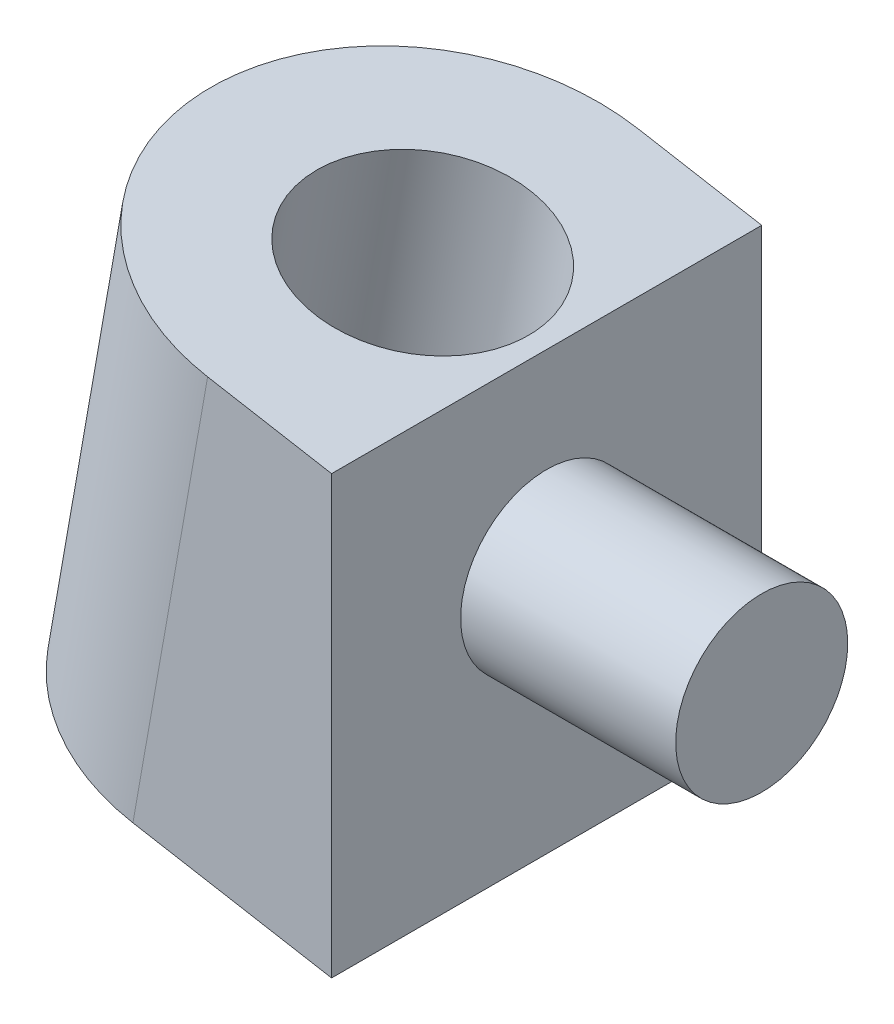
ISO-10303-21;
HEADER;
FILE_DESCRIPTION(('STEP AP214'),'2;1');
FILE_NAME('part.step','',(''),(''),'','','');
FILE_SCHEMA(('AUTOMOTIVE_DESIGN { 1 0 10303 214 1 1 1 1 }'));
ENDSEC;
DATA;
#1=APPLICATION_CONTEXT('core data for automotive mechanical design processes');
#2=APPLICATION_PROTOCOL_DEFINITION('international standard','automotive_design',2000,#1);
#3=PRODUCT_CONTEXT('',#1,'mechanical');
#4=PRODUCT('Part','Part','',(#3));
#5=PRODUCT_RELATED_PRODUCT_CATEGORY('part','',(#4));
#6=PRODUCT_DEFINITION_FORMATION('','',#4);
#7=PRODUCT_DEFINITION_CONTEXT('part definition',#1,'design');
#8=PRODUCT_DEFINITION('design','',#6,#7);
#9=PRODUCT_DEFINITION_SHAPE('','',#8);
#10=(LENGTH_UNIT() NAMED_UNIT(*) SI_UNIT(.MILLI.,.METRE.));
#11=(NAMED_UNIT(*) PLANE_ANGLE_UNIT() SI_UNIT($,.RADIAN.));
#12=(NAMED_UNIT(*) SI_UNIT($,.STERADIAN.) SOLID_ANGLE_UNIT());
#13=UNCERTAINTY_MEASURE_WITH_UNIT(LENGTH_MEASURE(1.E-05),#10,'distance_accuracy_value','');
#14=(GEOMETRIC_REPRESENTATION_CONTEXT(3) GLOBAL_UNCERTAINTY_ASSIGNED_CONTEXT((#13)) GLOBAL_UNIT_ASSIGNED_CONTEXT((#10,
#11,#12)) REPRESENTATION_CONTEXT('',''));
#15=CARTESIAN_POINT('',(0.,0.,0.));
#16=DIRECTION('',(0.,0.,1.));
#17=DIRECTION('',(1.,0.,0.));
#18=AXIS2_PLACEMENT_3D('',#15,#16,#17);
#19=CARTESIAN_POINT('',(-1.73648177666927,-9.84807753012208,0.));
#20=DIRECTION('',(-0.173648177666927,-0.984807753012209,0.));
#21=DIRECTION('',(0.984807753012209,-0.173648177666927,0.));
#22=AXIS2_PLACEMENT_3D('',#19,#20,#21);
#23=PLANE('',#22);
#24=CARTESIAN_POINT('',(-1.73648177666927,-9.84807753012208,0.));
#25=DIRECTION('',(-0.173648177666927,-0.984807753012209,0.));
#26=DIRECTION('',(0.984807753012209,-0.173648177666927,0.));
#27=AXIS2_PLACEMENT_3D('',#24,#25,#26);
#28=CIRCLE('',#27,5.);
#29=CARTESIAN_POINT('',(-6.66052054173032,-8.97983664178745,0.));
#30=VERTEX_POINT('',#29);
#31=EDGE_CURVE('E186',#30,#30,#28,.T.);
#32=ORIENTED_EDGE('',*,*,#31,.F.);
#33=EDGE_LOOP('',(#32));
#34=FACE_BOUND('',#33,.T.);
#35=DIRECTION('',(0.984807753012209,-0.173648177666927,0.));
#36=VECTOR('',#35,1.);
#37=CARTESIAN_POINT('',(-1.73648177666927,-9.84807753012209,10.));
#38=LINE('',#37,#36);
#39=CARTESIAN_POINT('',(-1.73648177666927,-9.84807753012209,10.));
#40=VERTEX_POINT('',#39);
#41=CARTESIAN_POINT('',(7.5,-11.4767184741709,10.));
#42=VERTEX_POINT('',#41);
#43=EDGE_CURVE('E114',#40,#42,#38,.T.);
#44=ORIENTED_EDGE('',*,*,#43,.F.);
#45=CARTESIAN_POINT('',(-1.73648177666927,-9.84807753012208,0.));
#46=DIRECTION('',(-0.173648177666927,-0.984807753012209,0.));
#47=DIRECTION('',(0.984807753012209,-0.173648177666927,0.));
#48=AXIS2_PLACEMENT_3D('',#45,#46,#47);
#49=CIRCLE('',#48,10.);
#50=CARTESIAN_POINT('',(-1.73648177666927,-9.84807753012209,-10.));
#51=VERTEX_POINT('',#50);
#52=EDGE_CURVE('E121',#40,#51,#49,.T.);
#53=ORIENTED_EDGE('',*,*,#52,.T.);
#54=DIRECTION('',(0.984807753012209,-0.173648177666927,0.));
#55=VECTOR('',#54,1.);
#56=CARTESIAN_POINT('',(-1.73648177666927,-9.84807753012209,-10.));
#57=LINE('',#56,#55);
#58=CARTESIAN_POINT('',(7.5,-11.4767184741709,-10.));
#59=VERTEX_POINT('',#58);
#60=EDGE_CURVE('E203',#51,#59,#57,.T.);
#61=ORIENTED_EDGE('',*,*,#60,.T.);
#62=DIRECTION('',(0.,0.,-1.));
#63=VECTOR('',#62,1.);
#64=CARTESIAN_POINT('',(7.5,-11.4767184741709,0.));
#65=LINE('',#64,#63);
#66=EDGE_CURVE('E168',#42,#59,#65,.T.);
#67=ORIENTED_EDGE('',*,*,#66,.F.);
#68=EDGE_LOOP('',(#44,#53,#61,#67));
#69=FACE_BOUND('',#68,.T.);
#70=ADVANCED_FACE('F105',(#34,#69),#23,.T.);
#71=CARTESIAN_POINT('',(0.,0.,0.));
#72=DIRECTION('',(-0.173648177666927,-0.984807753012209,0.));
#73=DIRECTION('',(0.984807753012209,-0.173648177666927,0.));
#74=AXIS2_PLACEMENT_3D('',#71,#72,#73);
#75=CYLINDRICAL_SURFACE('',#74,10.);
#76=ORIENTED_EDGE('',*,*,#52,.F.);
#77=DIRECTION('',(-0.173648177666927,-0.984807753012209,0.));
#78=VECTOR('',#77,1.);
#79=CARTESIAN_POINT('',(0.,0.,10.));
#80=LINE('',#79,#78);
#81=CARTESIAN_POINT('',(1.73648177666927,9.84807753012209,10.));
#82=VERTEX_POINT('',#81);
#83=EDGE_CURVE('E197',#82,#40,#80,.T.);
#84=ORIENTED_EDGE('',*,*,#83,.F.);
#85=CARTESIAN_POINT('',(1.73648177666927,9.84807753012209,0.));
#86=DIRECTION('',(-0.173648177666927,-0.984807753012209,0.));
#87=DIRECTION('',(0.984807753012209,-0.173648177666927,0.));
#88=AXIS2_PLACEMENT_3D('',#85,#86,#87);
#89=CIRCLE('',#88,10.);
#90=CARTESIAN_POINT('',(1.73648177666927,9.84807753012209,-10.));
#91=VERTEX_POINT('',#90);
#92=EDGE_CURVE('E150',#82,#91,#89,.T.);
#93=ORIENTED_EDGE('',*,*,#92,.T.);
#94=DIRECTION('',(-0.173648177666927,-0.984807753012209,0.));
#95=VECTOR('',#94,1.);
#96=CARTESIAN_POINT('',(0.,0.,-10.));
#97=LINE('',#96,#95);
#98=EDGE_CURVE('E199',#91,#51,#97,.T.);
#99=ORIENTED_EDGE('',*,*,#98,.T.);
#100=EDGE_LOOP('',(#76,#84,#93,#99));
#101=FACE_BOUND('',#100,.T.);
#102=ADVANCED_FACE('F213',(#101),#75,.T.);
#103=CARTESIAN_POINT('',(0.,0.,-10.));
#104=DIRECTION('',(0.,0.,-1.));
#105=DIRECTION('',(-1.,0.,0.));
#106=AXIS2_PLACEMENT_3D('',#103,#104,#105);
#107=PLANE('',#106);
#108=ORIENTED_EDGE('',*,*,#60,.F.);
#109=ORIENTED_EDGE('',*,*,#98,.F.);
#110=DIRECTION('',(0.984807753012209,-0.173648177666927,0.));
#111=VECTOR('',#110,1.);
#112=CARTESIAN_POINT('',(1.73648177666927,9.84807753012209,-10.));
#113=LINE('',#112,#111);
#114=CARTESIAN_POINT('',(7.5,8.83181376354398,-10.));
#115=VERTEX_POINT('',#114);
#116=EDGE_CURVE('E154',#91,#115,#113,.T.);
#117=ORIENTED_EDGE('',*,*,#116,.T.);
#118=DIRECTION('',(0.,-1.,0.));
#119=VECTOR('',#118,1.);
#120=CARTESIAN_POINT('',(7.5,8.83181376354398,-10.));
#121=LINE('',#120,#119);
#122=EDGE_CURVE('E163',#115,#59,#121,.T.);
#123=ORIENTED_EDGE('',*,*,#122,.T.);
#124=EDGE_LOOP('',(#108,#109,#117,#123));
#125=FACE_BOUND('',#124,.T.);
#126=ADVANCED_FACE('F215',(#125),#107,.T.);
#127=CARTESIAN_POINT('',(0.,0.,10.));
#128=DIRECTION('',(0.,0.,-1.));
#129=DIRECTION('',(-1.,0.,0.));
#130=AXIS2_PLACEMENT_3D('',#127,#128,#129);
#131=PLANE('',#130);
#132=ORIENTED_EDGE('',*,*,#43,.T.);
#133=DIRECTION('',(0.,-1.,0.));
#134=VECTOR('',#133,1.);
#135=CARTESIAN_POINT('',(7.5,8.83181376354398,10.));
#136=LINE('',#135,#134);
#137=CARTESIAN_POINT('',(7.5,8.83181376354398,10.));
#138=VERTEX_POINT('',#137);
#139=EDGE_CURVE('E161',#138,#42,#136,.T.);
#140=ORIENTED_EDGE('',*,*,#139,.F.);
#141=DIRECTION('',(0.984807753012209,-0.173648177666927,0.));
#142=VECTOR('',#141,1.);
#143=CARTESIAN_POINT('',(1.73648177666927,9.84807753012209,10.));
#144=LINE('',#143,#142);
#145=EDGE_CURVE('E144',#82,#138,#144,.T.);
#146=ORIENTED_EDGE('',*,*,#145,.F.);
#147=ORIENTED_EDGE('',*,*,#83,.T.);
#148=EDGE_LOOP('',(#132,#140,#146,#147));
#149=FACE_BOUND('',#148,.T.);
#150=ADVANCED_FACE('F166',(#149),#131,.F.);
#151=CARTESIAN_POINT('',(1.73648177666927,9.84807753012209,0.));
#152=DIRECTION('',(-0.173648177666927,-0.984807753012209,0.));
#153=DIRECTION('',(0.984807753012209,-0.173648177666927,0.));
#154=AXIS2_PLACEMENT_3D('',#151,#152,#153);
#155=PLANE('',#154);
#156=CARTESIAN_POINT('',(1.73648177666927,9.84807753012209,0.));
#157=DIRECTION('',(0.173648177666927,0.984807753012209,0.));
#158=DIRECTION('',(-0.984807753012209,0.173648177666927,0.));
#159=AXIS2_PLACEMENT_3D('',#156,#157,#158);
#160=CIRCLE('',#159,5.);
#161=CARTESIAN_POINT('',(-3.18755698839177,10.7163184184567,0.));
#162=VERTEX_POINT('',#161);
#163=EDGE_CURVE('E164',#162,#162,#160,.T.);
#164=ORIENTED_EDGE('',*,*,#163,.F.);
#165=EDGE_LOOP('',(#164));
#166=FACE_BOUND('',#165,.T.);
#167=ORIENTED_EDGE('',*,*,#145,.T.);
#168=DIRECTION('',(0.,0.,-1.));
#169=VECTOR('',#168,1.);
#170=CARTESIAN_POINT('',(7.5,8.83181376354398,0.));
#171=LINE('',#170,#169);
#172=EDGE_CURVE('E148',#138,#115,#171,.T.);
#173=ORIENTED_EDGE('',*,*,#172,.T.);
#174=ORIENTED_EDGE('',*,*,#116,.F.);
#175=ORIENTED_EDGE('',*,*,#92,.F.);
#176=EDGE_LOOP('',(#167,#173,#174,#175));
#177=FACE_BOUND('',#176,.T.);
#178=ADVANCED_FACE('F146',(#166,#177),#155,.F.);
#179=CARTESIAN_POINT('',(-2.18490352616104,-12.391203645536,0.));
#180=DIRECTION('',(0.173648177666927,0.984807753012208,0.));
#181=DIRECTION('',(-0.984807753012209,0.173648177666927,0.));
#182=AXIS2_PLACEMENT_3D('',#179,#180,#181);
#183=CYLINDRICAL_SURFACE('',#182,5.);
#184=CARTESIAN_POINT('',(-6.66052054173032,-8.97983664178745,0.));
#185=CARTESIAN_POINT('',(-6.62434383804971,-8.7746683599099,0.));
#186=CARTESIAN_POINT('',(-6.5881671343691,-8.56950007803236,0.));
#187=CARTESIAN_POINT('',(-6.51581372700788,-8.15916351427728,0.));
#188=CARTESIAN_POINT('',(-6.47963702332727,-7.95399523239973,0.));
#189=CARTESIAN_POINT('',(-6.40728361596605,-7.54365866864465,0.));
#190=CARTESIAN_POINT('',(-6.37110691228544,-7.3384903867671,0.));
#191=CARTESIAN_POINT('',(-6.29875350492422,-6.92815382301201,0.));
#192=CARTESIAN_POINT('',(-6.26257680124361,-6.72298554113447,0.));
#193=CARTESIAN_POINT('',(-6.19022339388239,-6.31264897737938,0.));
#194=CARTESIAN_POINT('',(-6.15404669020178,-6.10748069550184,0.));
#195=CARTESIAN_POINT('',(-6.08169328284056,-5.69714413174675,0.));
#196=CARTESIAN_POINT('',(-6.04551657915995,-5.49197584986921,0.));
#197=CARTESIAN_POINT('',(-5.97316317179873,-5.08163928611412,0.));
#198=CARTESIAN_POINT('',(-5.93698646811812,-4.87647100423658,0.));
#199=CARTESIAN_POINT('',(-5.8646330607569,-4.46613444048149,0.));
#200=CARTESIAN_POINT('',(-5.82845635707629,-4.26096615860395,0.));
#201=CARTESIAN_POINT('',(-5.75610294971507,-3.85062959484886,0.));
#202=CARTESIAN_POINT('',(-5.71992624603446,-3.64546131297132,0.));
#203=CARTESIAN_POINT('',(-5.64757283867324,-3.23512474921623,0.));
#204=CARTESIAN_POINT('',(-5.61139613499263,-3.02995646733869,0.));
#205=CARTESIAN_POINT('',(-5.53904272763141,-2.6196199035836,0.));
#206=CARTESIAN_POINT('',(-5.5028660239508,-2.41445162170606,0.));
#207=CARTESIAN_POINT('',(-5.43051261658958,-2.00411505795097,0.));
#208=CARTESIAN_POINT('',(-5.39433591290897,-1.79894677607343,0.));
#209=CARTESIAN_POINT('',(-5.32198250554775,-1.38861021231834,0.));
#210=CARTESIAN_POINT('',(-5.28580580186714,-1.1834419304408,0.));
#211=CARTESIAN_POINT('',(-5.21345239450592,-0.77310536668571,0.));
#212=CARTESIAN_POINT('',(-5.17727569082531,-0.567937084808166,0.));
#213=CARTESIAN_POINT('',(-5.10492228346409,-0.15760052105308,0.));
#214=CARTESIAN_POINT('',(-5.06874557978348,0.0475677608244626,0.));
#215=CARTESIAN_POINT('',(-4.99639217242226,0.457904324579548,0.));
#216=CARTESIAN_POINT('',(-4.96021546874165,0.663072606457091,0.));
#217=CARTESIAN_POINT('',(-4.88786206138043,1.07340917021218,0.));
#218=CARTESIAN_POINT('',(-4.85168535769982,1.27857745208972,0.));
#219=CARTESIAN_POINT('',(-4.7793319503386,1.68891401584481,0.));
#220=CARTESIAN_POINT('',(-4.74315524665799,1.89408229772235,0.));
#221=CARTESIAN_POINT('',(-4.67080183929677,2.30441886147744,0.));
#222=CARTESIAN_POINT('',(-4.63462513561616,2.50958714335498,0.));
#223=CARTESIAN_POINT('',(-4.56227172825494,2.91992370711007,0.));
#224=CARTESIAN_POINT('',(-4.52609502457433,3.12509198898761,0.));
#225=CARTESIAN_POINT('',(-4.45374161721311,3.5354285527427,0.));
#226=CARTESIAN_POINT('',(-4.41756491353251,3.74059683462024,0.));
#227=CARTESIAN_POINT('',(-4.34521150617129,4.15093339837533,0.));
#228=CARTESIAN_POINT('',(-4.30903480249068,4.35610168025287,0.));
#229=CARTESIAN_POINT('',(-4.23668139512946,4.76643824400796,0.));
#230=CARTESIAN_POINT('',(-4.20050469144885,4.9716065258855,0.));
#231=CARTESIAN_POINT('',(-4.12815128408763,5.38194308964059,0.));
#232=CARTESIAN_POINT('',(-4.09197458040702,5.58711137151813,0.));
#233=CARTESIAN_POINT('',(-4.0196211730458,5.99744793527322,0.));
#234=CARTESIAN_POINT('',(-3.98344446936519,6.20261621715076,0.));
#235=CARTESIAN_POINT('',(-3.91109106200397,6.61295278090585,0.));
#236=CARTESIAN_POINT('',(-3.87491435832336,6.8181210627834,0.));
#237=CARTESIAN_POINT('',(-3.80256095096214,7.22845762653848,0.));
#238=CARTESIAN_POINT('',(-3.76638424728153,7.43362590841603,0.));
#239=CARTESIAN_POINT('',(-3.69403083992031,7.84396247217111,0.));
#240=CARTESIAN_POINT('',(-3.6578541362397,8.04913075404866,0.));
#241=CARTESIAN_POINT('',(-3.58550072887848,8.45946731780374,0.));
#242=CARTESIAN_POINT('',(-3.54932402519787,8.66463559968129,0.));
#243=CARTESIAN_POINT('',(-3.47697061783665,9.07497216343637,0.));
#244=CARTESIAN_POINT('',(-3.44079391415604,9.28014044531392,0.));
#245=CARTESIAN_POINT('',(-3.36844050679482,9.690477009069,0.));
#246=CARTESIAN_POINT('',(-3.33226380311421,9.89564529094655,0.));
#247=CARTESIAN_POINT('',(-3.25991039575299,10.3059818547016,0.));
#248=CARTESIAN_POINT('',(-3.22373369207238,10.5111501365792,0.));
#249=CARTESIAN_POINT('',(-3.18755698839177,10.7163184184567,0.));
#250=B_SPLINE_CURVE_WITH_KNOTS('',3,(#184,#185,#186,#187,#188,#189,#190,#191,#192,#193,#194,
#195,#196,#197,#198,#199,#200,#201,#202,#203,#204,#205,#206,#207,#208,#209,#210,#211,#212,#213,
#214,#215,#216,#217,#218,#219,#220,#221,#222,#223,#224,#225,#226,#227,#228,#229,#230,#231,#232,
#233,#234,#235,#236,#237,#238,#239,#240,#241,#242,#243,#244,#245,#246,#247,#248,#249),
.UNSPECIFIED.,.F.,.F.,(4,2,2,2,2,2,2,2,2,2,2,2,2,2,2,2,2,2,2,2,2,2,2,2,2,2,2,2,2,2,2,2,4),(0.,
0.625000000000001,1.25,1.875,2.5,3.125,3.75,4.375,5.,5.625,6.25,6.875,7.5,8.125,8.75,9.375,10.,
10.625,11.25,11.875,12.5,13.125,13.75,14.375,15.,15.625,16.25,16.875,17.5,18.125,18.75,19.375,
20.),.UNSPECIFIED.);
#251=EDGE_CURVE('BSEAM224',#30,#162,#250,.T.);
#252=ORIENTED_EDGE('',*,*,#31,.T.);
#253=ORIENTED_EDGE('',*,*,#163,.T.);
#254=ORIENTED_EDGE('',*,*,#251,.T.);
#255=ORIENTED_EDGE('',*,*,#251,.F.);
#256=EDGE_LOOP('',(#252,#254,#253,#255));
#257=FACE_BOUND('',#256,.T.);
#258=ADVANCED_FACE('F224',(#257),#183,.F.);
#259=CARTESIAN_POINT('',(7.5,8.83181376354398,0.));
#260=DIRECTION('',(1.,0.,0.));
#261=DIRECTION('',(0.,0.,-1.));
#262=AXIS2_PLACEMENT_3D('',#259,#260,#261);
#263=PLANE('',#262);
#264=CARTESIAN_POINT('',(7.5,0.,0.));
#265=DIRECTION('',(1.,0.,0.));
#266=DIRECTION('',(0.,0.,-1.));
#267=AXIS2_PLACEMENT_3D('',#264,#265,#266);
#268=CIRCLE('',#267,4.);
#269=CARTESIAN_POINT('',(7.5,0.,-4.));
#270=VERTEX_POINT('',#269);
#271=EDGE_CURVE('E12',#270,#270,#268,.T.);
#272=ORIENTED_EDGE('',*,*,#271,.F.);
#273=EDGE_LOOP('',(#272));
#274=FACE_BOUND('',#273,.T.);
#275=ORIENTED_EDGE('',*,*,#122,.F.);
#276=ORIENTED_EDGE('',*,*,#172,.F.);
#277=ORIENTED_EDGE('',*,*,#139,.T.);
#278=ORIENTED_EDGE('',*,*,#66,.T.);
#279=EDGE_LOOP('',(#275,#276,#277,#278));
#280=FACE_BOUND('',#279,.T.);
#281=ADVANCED_FACE('F159',(#274,#280),#263,.T.);
#282=CARTESIAN_POINT('',(17.5,0.,0.));
#283=DIRECTION('',(-1.,0.,0.));
#284=DIRECTION('',(0.,0.,1.));
#285=AXIS2_PLACEMENT_3D('',#282,#283,#284);
#286=CYLINDRICAL_SURFACE('',#285,4.);
#287=CARTESIAN_POINT('',(17.5,0.,0.));
#288=DIRECTION('',(1.,0.,0.));
#289=DIRECTION('',(0.,0.,-1.));
#290=AXIS2_PLACEMENT_3D('',#287,#288,#289);
#291=CIRCLE('',#290,4.);
#292=CARTESIAN_POINT('',(17.5,0.,-4.));
#293=VERTEX_POINT('',#292);
#294=EDGE_CURVE('E169',#293,#293,#291,.T.);
#295=ORIENTED_EDGE('',*,*,#294,.F.);
#296=EDGE_LOOP('',(#295));
#297=FACE_BOUND('',#296,.T.);
#298=ORIENTED_EDGE('',*,*,#271,.T.);
#299=EDGE_LOOP('',(#298));
#300=FACE_BOUND('',#299,.T.);
#301=ADVANCED_FACE('F238',(#297,#300),#286,.T.);
#302=CARTESIAN_POINT('',(17.5,0.,0.));
#303=DIRECTION('',(1.,0.,0.));
#304=DIRECTION('',(0.,0.,-1.));
#305=AXIS2_PLACEMENT_3D('',#302,#303,#304);
#306=PLANE('',#305);
#307=ORIENTED_EDGE('',*,*,#294,.T.);
#308=EDGE_LOOP('',(#307));
#309=FACE_BOUND('',#308,.T.);
#310=ADVANCED_FACE('F242',(#309),#306,.T.);
#311=CLOSED_SHELL('',(#70,#102,#126,#150,#178,#258,#281,#301,#310));
#312=MANIFOLD_SOLID_BREP('B2',#311);
#313=ADVANCED_BREP_SHAPE_REPRESENTATION('',(#18,#312),#14);
#314=SHAPE_DEFINITION_REPRESENTATION(#9,#313);
ENDSEC;
END-ISO-10303-21;
